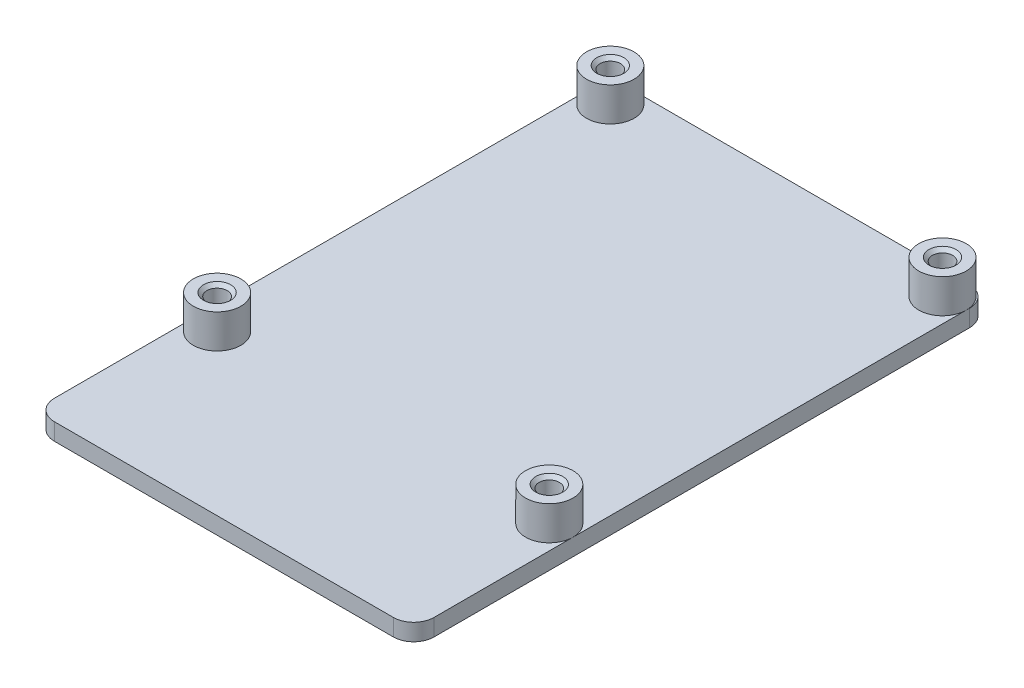
ISO-10303-21;
HEADER;
FILE_DESCRIPTION(('STEP AP214'),'2;1');
FILE_NAME('part.step','',(''),(''),'','','');
FILE_SCHEMA(('AUTOMOTIVE_DESIGN { 1 0 10303 214 1 1 1 1 }'));
ENDSEC;
DATA;
#1=APPLICATION_CONTEXT('core data for automotive mechanical design processes');
#2=APPLICATION_PROTOCOL_DEFINITION('international standard','automotive_design',2000,#1);
#3=PRODUCT_CONTEXT('',#1,'mechanical');
#4=PRODUCT('Part','Part','',(#3));
#5=PRODUCT_RELATED_PRODUCT_CATEGORY('part','',(#4));
#6=PRODUCT_DEFINITION_FORMATION('','',#4);
#7=PRODUCT_DEFINITION_CONTEXT('part definition',#1,'design');
#8=PRODUCT_DEFINITION('design','',#6,#7);
#9=PRODUCT_DEFINITION_SHAPE('','',#8);
#10=(LENGTH_UNIT() NAMED_UNIT(*) SI_UNIT(.MILLI.,.METRE.));
#11=(NAMED_UNIT(*) PLANE_ANGLE_UNIT() SI_UNIT($,.RADIAN.));
#12=(NAMED_UNIT(*) SI_UNIT($,.STERADIAN.) SOLID_ANGLE_UNIT());
#13=UNCERTAINTY_MEASURE_WITH_UNIT(LENGTH_MEASURE(1.E-05),#10,'distance_accuracy_value','');
#14=(GEOMETRIC_REPRESENTATION_CONTEXT(3) GLOBAL_UNCERTAINTY_ASSIGNED_CONTEXT((#13)) GLOBAL_UNIT_ASSIGNED_CONTEXT((#10,
#11,#12)) REPRESENTATION_CONTEXT('',''));
#15=CARTESIAN_POINT('',(0.,0.,0.));
#16=DIRECTION('',(0.,0.,1.));
#17=DIRECTION('',(1.,0.,0.));
#18=AXIS2_PLACEMENT_3D('',#15,#16,#17);
#19=CARTESIAN_POINT('',(-65.,2.5,-85.95));
#20=DIRECTION('',(0.,1.,0.));
#21=DIRECTION('',(0.,0.,1.));
#22=AXIS2_PLACEMENT_3D('',#19,#20,#21);
#23=PLANE('',#22);
#24=DIRECTION('',(-1.,0.,0.));
#25=VECTOR('',#24,1.);
#26=CARTESIAN_POINT('',(-65.,2.5,-88.95));
#27=LINE('',#26,#25);
#28=CARTESIAN_POINT('',(-15.,2.5,-88.95));
#29=VERTEX_POINT('',#28);
#30=CARTESIAN_POINT('',(-15.5,2.5,-88.95));
#31=VERTEX_POINT('',#30);
#32=EDGE_CURVE('E147',#29,#31,#27,.T.);
#33=ORIENTED_EDGE('',*,*,#32,.T.);
#34=CARTESIAN_POINT('',(-15.5,2.5,-85.45));
#35=DIRECTION('',(0.,1.,0.));
#36=DIRECTION('',(0.,0.,1.));
#37=AXIS2_PLACEMENT_3D('',#34,#35,#36);
#38=CIRCLE('',#37,3.5);
#39=CARTESIAN_POINT('',(-12.,2.5,-85.45));
#40=VERTEX_POINT('',#39);
#41=EDGE_CURVE('E138',#40,#31,#38,.T.);
#42=ORIENTED_EDGE('',*,*,#41,.F.);
#43=DIRECTION('',(0.,0.,-1.));
#44=VECTOR('',#43,1.);
#45=CARTESIAN_POINT('',(-12.,2.5,-85.95));
#46=LINE('',#45,#44);
#47=CARTESIAN_POINT('',(-12.,2.5,-85.95));
#48=VERTEX_POINT('',#47);
#49=EDGE_CURVE('E133',#40,#48,#46,.T.);
#50=ORIENTED_EDGE('',*,*,#49,.T.);
#51=CARTESIAN_POINT('',(-15.,2.5,-85.95));
#52=DIRECTION('',(0.,1.,0.));
#53=DIRECTION('',(0.,0.,1.));
#54=AXIS2_PLACEMENT_3D('',#51,#52,#53);
#55=CIRCLE('',#54,3.00000000000001);
#56=EDGE_CURVE('E163',#48,#29,#55,.T.);
#57=ORIENTED_EDGE('',*,*,#56,.T.);
#58=EDGE_LOOP('',(#33,#42,#50,#57));
#59=FACE_BOUND('',#58,.T.);
#60=ADVANCED_FACE('F39',(#59),#23,.T.);
#61=CARTESIAN_POINT('',(-64.5,2.5,-85.45));
#62=DIRECTION('',(0.,1.,0.));
#63=DIRECTION('',(0.,0.,1.));
#64=AXIS2_PLACEMENT_3D('',#61,#62,#63);
#65=CIRCLE('',#64,3.5);
#66=CARTESIAN_POINT('',(-64.5,2.5,-88.95));
#67=VERTEX_POINT('',#66);
#68=CARTESIAN_POINT('',(-68.,2.5,-85.45));
#69=VERTEX_POINT('',#68);
#70=EDGE_CURVE('E352',#67,#69,#65,.T.);
#71=ORIENTED_EDGE('',*,*,#70,.F.);
#72=CARTESIAN_POINT('',(-65.,2.5,-88.95));
#73=VERTEX_POINT('',#72);
#74=EDGE_CURVE('E165',#67,#73,#27,.T.);
#75=ORIENTED_EDGE('',*,*,#74,.T.);
#76=CARTESIAN_POINT('',(-65.,2.5,-85.95));
#77=DIRECTION('',(0.,1.,0.));
#78=DIRECTION('',(0.,0.,1.));
#79=AXIS2_PLACEMENT_3D('',#76,#77,#78);
#80=CIRCLE('',#79,2.99999999999999);
#81=CARTESIAN_POINT('',(-68.,2.5,-85.95));
#82=VERTEX_POINT('',#81);
#83=EDGE_CURVE('E199',#73,#82,#80,.T.);
#84=ORIENTED_EDGE('',*,*,#83,.T.);
#85=DIRECTION('',(0.,0.,1.));
#86=VECTOR('',#85,1.);
#87=CARTESIAN_POINT('',(-68.,2.5,-85.95));
#88=LINE('',#87,#86);
#89=EDGE_CURVE('E368',#82,#69,#88,.T.);
#90=ORIENTED_EDGE('',*,*,#89,.T.);
#91=EDGE_LOOP('',(#71,#75,#84,#90));
#92=FACE_BOUND('',#91,.T.);
#93=ADVANCED_FACE('F280',(#92),#23,.T.);
#94=CARTESIAN_POINT('',(-65.,2.5,-85.95));
#95=DIRECTION('',(0.,-1.,0.));
#96=DIRECTION('',(0.,0.,-1.));
#97=AXIS2_PLACEMENT_3D('',#94,#95,#96);
#98=CYLINDRICAL_SURFACE('',#97,2.99999999999999);
#99=CARTESIAN_POINT('',(-65.,0.,-85.95));
#100=DIRECTION('',(0.,1.,0.));
#101=DIRECTION('',(0.,0.,1.));
#102=AXIS2_PLACEMENT_3D('',#99,#100,#101);
#103=CIRCLE('',#102,2.99999999999999);
#104=CARTESIAN_POINT('',(-65.,0.,-88.95));
#105=VERTEX_POINT('',#104);
#106=CARTESIAN_POINT('',(-68.,0.,-85.95));
#107=VERTEX_POINT('',#106);
#108=EDGE_CURVE('E173',#105,#107,#103,.T.);
#109=ORIENTED_EDGE('',*,*,#108,.T.);
#110=DIRECTION('',(0.,-1.,0.));
#111=VECTOR('',#110,1.);
#112=CARTESIAN_POINT('',(-68.,2.5,-85.95));
#113=LINE('',#112,#111);
#114=EDGE_CURVE('E225',#82,#107,#113,.T.);
#115=ORIENTED_EDGE('',*,*,#114,.F.);
#116=ORIENTED_EDGE('',*,*,#83,.F.);
#117=DIRECTION('',(0.,-1.,0.));
#118=VECTOR('',#117,1.);
#119=CARTESIAN_POINT('',(-65.,2.5,-88.95));
#120=LINE('',#119,#118);
#121=EDGE_CURVE('E172',#73,#105,#120,.T.);
#122=ORIENTED_EDGE('',*,*,#121,.T.);
#123=EDGE_LOOP('',(#109,#115,#116,#122));
#124=FACE_BOUND('',#123,.T.);
#125=ADVANCED_FACE('F287',(#124),#98,.T.);
#126=CARTESIAN_POINT('',(-68.,2.5,-85.95));
#127=DIRECTION('',(1.,0.,0.));
#128=DIRECTION('',(0.,0.,-1.));
#129=AXIS2_PLACEMENT_3D('',#126,#127,#128);
#130=PLANE('',#129);
#131=DIRECTION('',(0.,0.,1.));
#132=VECTOR('',#131,1.);
#133=CARTESIAN_POINT('',(-68.,0.,-85.95));
#134=LINE('',#133,#132);
#135=CARTESIAN_POINT('',(-68.,0.,-6.94999999999999));
#136=VERTEX_POINT('',#135);
#137=EDGE_CURVE('E177',#107,#136,#134,.T.);
#138=ORIENTED_EDGE('',*,*,#137,.T.);
#139=DIRECTION('',(0.,-1.,0.));
#140=VECTOR('',#139,1.);
#141=CARTESIAN_POINT('',(-68.,2.5,-6.94999999999999));
#142=LINE('',#141,#140);
#143=CARTESIAN_POINT('',(-68.,2.5,-6.94999999999999));
#144=VERTEX_POINT('',#143);
#145=EDGE_CURVE('E221',#144,#136,#142,.T.);
#146=ORIENTED_EDGE('',*,*,#145,.F.);
#147=CARTESIAN_POINT('',(-68.,2.5,-27.45));
#148=VERTEX_POINT('',#147);
#149=EDGE_CURVE('E367',#148,#144,#88,.T.);
#150=ORIENTED_EDGE('',*,*,#149,.F.);
#151=EDGE_CURVE('E373',#69,#148,#88,.T.);
#152=ORIENTED_EDGE('',*,*,#151,.F.);
#153=ORIENTED_EDGE('',*,*,#89,.F.);
#154=ORIENTED_EDGE('',*,*,#114,.T.);
#155=EDGE_LOOP('',(#138,#146,#150,#152,#153,#154));
#156=FACE_BOUND('',#155,.T.);
#157=ADVANCED_FACE('F404',(#156),#130,.F.);
#158=CARTESIAN_POINT('',(-65.,2.5,-6.95000000000001));
#159=DIRECTION('',(0.,-1.,0.));
#160=DIRECTION('',(0.,0.,-1.));
#161=AXIS2_PLACEMENT_3D('',#158,#159,#160);
#162=CYLINDRICAL_SURFACE('',#161,2.99999999999999);
#163=CARTESIAN_POINT('',(-65.,0.,-6.95000000000001));
#164=DIRECTION('',(0.,1.,0.));
#165=DIRECTION('',(0.,0.,1.));
#166=AXIS2_PLACEMENT_3D('',#163,#164,#165);
#167=CIRCLE('',#166,2.99999999999999);
#168=CARTESIAN_POINT('',(-65.,0.,-3.95000000000002));
#169=VERTEX_POINT('',#168);
#170=EDGE_CURVE('E181',#136,#169,#167,.T.);
#171=ORIENTED_EDGE('',*,*,#170,.T.);
#172=DIRECTION('',(0.,-1.,0.));
#173=VECTOR('',#172,1.);
#174=CARTESIAN_POINT('',(-65.,2.5,-3.95000000000002));
#175=LINE('',#174,#173);
#176=CARTESIAN_POINT('',(-65.,2.5,-3.95000000000002));
#177=VERTEX_POINT('',#176);
#178=EDGE_CURVE('E217',#177,#169,#175,.T.);
#179=ORIENTED_EDGE('',*,*,#178,.F.);
#180=CARTESIAN_POINT('',(-65.,2.5,-6.95000000000001));
#181=DIRECTION('',(0.,1.,0.));
#182=DIRECTION('',(0.,0.,1.));
#183=AXIS2_PLACEMENT_3D('',#180,#181,#182);
#184=CIRCLE('',#183,2.99999999999999);
#185=EDGE_CURVE('E372',#144,#177,#184,.T.);
#186=ORIENTED_EDGE('',*,*,#185,.F.);
#187=ORIENTED_EDGE('',*,*,#145,.T.);
#188=EDGE_LOOP('',(#171,#179,#186,#187));
#189=FACE_BOUND('',#188,.T.);
#190=ADVANCED_FACE('F412',(#189),#162,.T.);
#191=CARTESIAN_POINT('',(-65.,2.5,-3.95000000000002));
#192=DIRECTION('',(0.,0.,-1.));
#193=DIRECTION('',(-1.,0.,0.));
#194=AXIS2_PLACEMENT_3D('',#191,#192,#193);
#195=PLANE('',#194);
#196=DIRECTION('',(1.,0.,0.));
#197=VECTOR('',#196,1.);
#198=CARTESIAN_POINT('',(-65.,0.,-3.95000000000002));
#199=LINE('',#198,#197);
#200=CARTESIAN_POINT('',(-15.,0.,-3.94999999999999));
#201=VERTEX_POINT('',#200);
#202=EDGE_CURVE('E184',#169,#201,#199,.T.);
#203=ORIENTED_EDGE('',*,*,#202,.T.);
#204=DIRECTION('',(0.,-1.,0.));
#205=VECTOR('',#204,1.);
#206=CARTESIAN_POINT('',(-15.,2.5,-3.94999999999999));
#207=LINE('',#206,#205);
#208=CARTESIAN_POINT('',(-15.,2.5,-3.94999999999999));
#209=VERTEX_POINT('',#208);
#210=EDGE_CURVE('E213',#209,#201,#207,.T.);
#211=ORIENTED_EDGE('',*,*,#210,.F.);
#212=DIRECTION('',(1.,0.,0.));
#213=VECTOR('',#212,1.);
#214=CARTESIAN_POINT('',(-65.,2.5,-3.95000000000002));
#215=LINE('',#214,#213);
#216=EDGE_CURVE('E159',#177,#209,#215,.T.);
#217=ORIENTED_EDGE('',*,*,#216,.F.);
#218=ORIENTED_EDGE('',*,*,#178,.T.);
#219=EDGE_LOOP('',(#203,#211,#217,#218));
#220=FACE_BOUND('',#219,.T.);
#221=ADVANCED_FACE('F384',(#220),#195,.F.);
#222=CARTESIAN_POINT('',(-15.,2.5,-6.95));
#223=DIRECTION('',(0.,-1.,0.));
#224=DIRECTION('',(0.,0.,-1.));
#225=AXIS2_PLACEMENT_3D('',#222,#223,#224);
#226=CYLINDRICAL_SURFACE('',#225,3.00000000000001);
#227=CARTESIAN_POINT('',(-15.,0.,-6.95));
#228=DIRECTION('',(0.,1.,0.));
#229=DIRECTION('',(0.,0.,1.));
#230=AXIS2_PLACEMENT_3D('',#227,#228,#229);
#231=CIRCLE('',#230,3.00000000000001);
#232=CARTESIAN_POINT('',(-12.,0.,-6.95));
#233=VERTEX_POINT('',#232);
#234=EDGE_CURVE('E187',#201,#233,#231,.T.);
#235=ORIENTED_EDGE('',*,*,#234,.T.);
#236=DIRECTION('',(0.,-1.,0.));
#237=VECTOR('',#236,1.);
#238=CARTESIAN_POINT('',(-12.,2.5,-6.95));
#239=LINE('',#238,#237);
#240=CARTESIAN_POINT('',(-12.,2.5,-6.95));
#241=VERTEX_POINT('',#240);
#242=EDGE_CURVE('E209',#241,#233,#239,.T.);
#243=ORIENTED_EDGE('',*,*,#242,.F.);
#244=CARTESIAN_POINT('',(-15.,2.5,-6.95));
#245=DIRECTION('',(0.,1.,0.));
#246=DIRECTION('',(0.,0.,1.));
#247=AXIS2_PLACEMENT_3D('',#244,#245,#246);
#248=CIRCLE('',#247,3.00000000000001);
#249=EDGE_CURVE('E157',#209,#241,#248,.T.);
#250=ORIENTED_EDGE('',*,*,#249,.F.);
#251=ORIENTED_EDGE('',*,*,#210,.T.);
#252=EDGE_LOOP('',(#235,#243,#250,#251));
#253=FACE_BOUND('',#252,.T.);
#254=ADVANCED_FACE('F388',(#253),#226,.T.);
#255=CARTESIAN_POINT('',(-12.,2.5,-85.95));
#256=DIRECTION('',(-1.,0.,0.));
#257=DIRECTION('',(0.,0.,1.));
#258=AXIS2_PLACEMENT_3D('',#255,#256,#257);
#259=PLANE('',#258);
#260=DIRECTION('',(0.,0.,-1.));
#261=VECTOR('',#260,1.);
#262=CARTESIAN_POINT('',(-12.,0.,-85.95));
#263=LINE('',#262,#261);
#264=CARTESIAN_POINT('',(-12.,0.,-85.95));
#265=VERTEX_POINT('',#264);
#266=EDGE_CURVE('E190',#233,#265,#263,.T.);
#267=ORIENTED_EDGE('',*,*,#266,.T.);
#268=DIRECTION('',(0.,-1.,0.));
#269=VECTOR('',#268,1.);
#270=CARTESIAN_POINT('',(-12.,2.5,-85.95));
#271=LINE('',#270,#269);
#272=EDGE_CURVE('E154',#48,#265,#271,.T.);
#273=ORIENTED_EDGE('',*,*,#272,.F.);
#274=ORIENTED_EDGE('',*,*,#49,.F.);
#275=CARTESIAN_POINT('',(-12.,2.5,-27.45));
#276=VERTEX_POINT('',#275);
#277=EDGE_CURVE('E121',#276,#40,#46,.T.);
#278=ORIENTED_EDGE('',*,*,#277,.F.);
#279=EDGE_CURVE('E132',#241,#276,#46,.T.);
#280=ORIENTED_EDGE('',*,*,#279,.F.);
#281=ORIENTED_EDGE('',*,*,#242,.T.);
#282=EDGE_LOOP('',(#267,#273,#274,#278,#280,#281));
#283=FACE_BOUND('',#282,.T.);
#284=ADVANCED_FACE('F152',(#283),#259,.F.);
#285=CARTESIAN_POINT('',(-15.,2.5,-85.95));
#286=DIRECTION('',(0.,-1.,0.));
#287=DIRECTION('',(0.,0.,-1.));
#288=AXIS2_PLACEMENT_3D('',#285,#286,#287);
#289=CYLINDRICAL_SURFACE('',#288,3.00000000000001);
#290=CARTESIAN_POINT('',(-15.,0.,-85.95));
#291=DIRECTION('',(0.,1.,0.));
#292=DIRECTION('',(0.,0.,1.));
#293=AXIS2_PLACEMENT_3D('',#290,#291,#292);
#294=CIRCLE('',#293,3.00000000000001);
#295=CARTESIAN_POINT('',(-15.,0.,-88.95));
#296=VERTEX_POINT('',#295);
#297=EDGE_CURVE('E193',#265,#296,#294,.T.);
#298=ORIENTED_EDGE('',*,*,#297,.T.);
#299=DIRECTION('',(0.,-1.,0.));
#300=VECTOR('',#299,1.);
#301=CARTESIAN_POINT('',(-15.,2.5,-88.95));
#302=LINE('',#301,#300);
#303=EDGE_CURVE('E203',#29,#296,#302,.T.);
#304=ORIENTED_EDGE('',*,*,#303,.F.);
#305=ORIENTED_EDGE('',*,*,#56,.F.);
#306=ORIENTED_EDGE('',*,*,#272,.T.);
#307=EDGE_LOOP('',(#298,#304,#305,#306));
#308=FACE_BOUND('',#307,.T.);
#309=ADVANCED_FACE('F334',(#308),#289,.T.);
#310=CARTESIAN_POINT('',(-65.,2.5,-88.95));
#311=DIRECTION('',(0.,0.,1.));
#312=DIRECTION('',(1.,0.,0.));
#313=AXIS2_PLACEMENT_3D('',#310,#311,#312);
#314=PLANE('',#313);
#315=DIRECTION('',(-1.,0.,0.));
#316=VECTOR('',#315,1.);
#317=CARTESIAN_POINT('',(-65.,0.,-88.95));
#318=LINE('',#317,#316);
#319=EDGE_CURVE('E196',#296,#105,#318,.T.);
#320=ORIENTED_EDGE('',*,*,#319,.T.);
#321=ORIENTED_EDGE('',*,*,#121,.F.);
#322=ORIENTED_EDGE('',*,*,#74,.F.);
#323=EDGE_CURVE('E168',#31,#67,#27,.T.);
#324=ORIENTED_EDGE('',*,*,#323,.F.);
#325=ORIENTED_EDGE('',*,*,#32,.F.);
#326=ORIENTED_EDGE('',*,*,#303,.T.);
#327=EDGE_LOOP('',(#320,#321,#322,#324,#325,#326));
#328=FACE_BOUND('',#327,.T.);
#329=ADVANCED_FACE('F327',(#328),#314,.F.);
#330=ORIENTED_EDGE('',*,*,#151,.T.);
#331=CARTESIAN_POINT('',(-64.5,2.5,-27.45));
#332=DIRECTION('',(0.,1.,0.));
#333=DIRECTION('',(0.,0.,1.));
#334=AXIS2_PLACEMENT_3D('',#331,#332,#333);
#335=CIRCLE('',#334,3.5);
#336=EDGE_CURVE('E53',#148,#148,#335,.T.);
#337=ORIENTED_EDGE('',*,*,#336,.F.);
#338=ORIENTED_EDGE('',*,*,#149,.T.);
#339=ORIENTED_EDGE('',*,*,#185,.T.);
#340=ORIENTED_EDGE('',*,*,#216,.T.);
#341=ORIENTED_EDGE('',*,*,#249,.T.);
#342=ORIENTED_EDGE('',*,*,#279,.T.);
#343=CARTESIAN_POINT('',(-15.5,2.5,-27.45));
#344=DIRECTION('',(0.,1.,0.));
#345=DIRECTION('',(0.,0.,1.));
#346=AXIS2_PLACEMENT_3D('',#343,#344,#345);
#347=CIRCLE('',#346,3.5);
#348=EDGE_CURVE('E58',#276,#276,#347,.T.);
#349=ORIENTED_EDGE('',*,*,#348,.F.);
#350=ORIENTED_EDGE('',*,*,#277,.T.);
#351=CARTESIAN_POINT('',(-15.5,2.5,-85.45));
#352=DIRECTION('',(0.,1.,0.));
#353=DIRECTION('',(0.,0.,1.));
#354=AXIS2_PLACEMENT_3D('',#351,#352,#353);
#355=CIRCLE('',#354,3.5);
#356=EDGE_CURVE('E125',#40,#31,#355,.F.);
#357=ORIENTED_EDGE('',*,*,#356,.T.);
#358=ORIENTED_EDGE('',*,*,#323,.T.);
#359=EDGE_CURVE('E229',#69,#67,#65,.T.);
#360=ORIENTED_EDGE('',*,*,#359,.F.);
#361=EDGE_LOOP('',(#330,#337,#338,#339,#340,#341,#342,#349,#350,#357,#358,#360));
#362=FACE_BOUND('',#361,.T.);
#363=ADVANCED_FACE('F124',(#362),#23,.T.);
#364=CARTESIAN_POINT('',(-65.,0.,-85.95));
#365=DIRECTION('',(0.,1.,0.));
#366=DIRECTION('',(0.,0.,1.));
#367=AXIS2_PLACEMENT_3D('',#364,#365,#366);
#368=PLANE('',#367);
#369=ORIENTED_EDGE('',*,*,#108,.F.);
#370=ORIENTED_EDGE('',*,*,#319,.F.);
#371=ORIENTED_EDGE('',*,*,#297,.F.);
#372=ORIENTED_EDGE('',*,*,#266,.F.);
#373=ORIENTED_EDGE('',*,*,#234,.F.);
#374=ORIENTED_EDGE('',*,*,#202,.F.);
#375=ORIENTED_EDGE('',*,*,#170,.F.);
#376=ORIENTED_EDGE('',*,*,#137,.F.);
#377=EDGE_LOOP('',(#369,#370,#371,#372,#373,#374,#375,#376));
#378=FACE_BOUND('',#377,.T.);
#379=ADVANCED_FACE('F326',(#378),#368,.F.);
#380=CARTESIAN_POINT('',(-64.5,7.5,-85.45));
#381=DIRECTION('',(0.,1.,0.));
#382=DIRECTION('',(0.,0.,1.));
#383=AXIS2_PLACEMENT_3D('',#380,#381,#382);
#384=PLANE('',#383);
#385=CARTESIAN_POINT('',(-64.5,7.5,-85.45));
#386=DIRECTION('',(0.,1.,0.));
#387=DIRECTION('',(0.,0.,1.));
#388=AXIS2_PLACEMENT_3D('',#385,#386,#387);
#389=CIRCLE('',#388,2.00000000000003);
#390=CARTESIAN_POINT('',(-64.5,7.5,-83.45));
#391=VERTEX_POINT('',#390);
#392=EDGE_CURVE('E11',#391,#391,#389,.F.);
#393=ORIENTED_EDGE('',*,*,#392,.T.);
#394=EDGE_LOOP('',(#393));
#395=FACE_BOUND('',#394,.T.);
#396=CARTESIAN_POINT('',(-64.5,7.5,-85.45));
#397=DIRECTION('',(0.,1.,0.));
#398=DIRECTION('',(0.,0.,1.));
#399=AXIS2_PLACEMENT_3D('',#396,#397,#398);
#400=CIRCLE('',#399,3.5);
#401=CARTESIAN_POINT('',(-64.5,7.5,-81.95));
#402=VERTEX_POINT('',#401);
#403=EDGE_CURVE('E178',#402,#402,#400,.T.);
#404=ORIENTED_EDGE('',*,*,#403,.T.);
#405=EDGE_LOOP('',(#404));
#406=FACE_BOUND('',#405,.T.);
#407=ADVANCED_FACE('F332',(#395,#406),#384,.T.);
#408=CARTESIAN_POINT('',(-64.5,7.5,-85.45));
#409=DIRECTION('',(0.,-1.,0.));
#410=DIRECTION('',(0.,0.,-1.));
#411=AXIS2_PLACEMENT_3D('',#408,#409,#410);
#412=CYLINDRICAL_SURFACE('',#411,3.5);
#413=ORIENTED_EDGE('',*,*,#403,.F.);
#414=EDGE_LOOP('',(#413));
#415=FACE_BOUND('',#414,.T.);
#416=ORIENTED_EDGE('',*,*,#70,.T.);
#417=ORIENTED_EDGE('',*,*,#359,.T.);
#418=EDGE_LOOP('',(#416,#417));
#419=FACE_BOUND('',#418,.T.);
#420=ADVANCED_FACE('F346',(#415,#419),#412,.T.);
#421=CARTESIAN_POINT('',(-64.5,7.5,-85.45));
#422=DIRECTION('',(0.,-1.,0.));
#423=DIRECTION('',(0.,0.,-1.));
#424=AXIS2_PLACEMENT_3D('',#421,#422,#423);
#425=CYLINDRICAL_SURFACE('',#424,1.5);
#426=CARTESIAN_POINT('',(-64.5,6.99999999999996,-85.45));
#427=DIRECTION('',(0.,1.,0.));
#428=DIRECTION('',(0.,0.,1.));
#429=AXIS2_PLACEMENT_3D('',#426,#427,#428);
#430=CIRCLE('',#429,1.5);
#431=CARTESIAN_POINT('',(-64.5,6.99999999999996,-83.95));
#432=VERTEX_POINT('',#431);
#433=EDGE_CURVE('E48',#432,#432,#430,.T.);
#434=ORIENTED_EDGE('',*,*,#433,.T.);
#435=EDGE_LOOP('',(#434));
#436=FACE_BOUND('',#435,.T.);
#437=CARTESIAN_POINT('',(-64.5,2.5,-85.45));
#438=DIRECTION('',(0.,1.,0.));
#439=DIRECTION('',(0.,0.,1.));
#440=AXIS2_PLACEMENT_3D('',#437,#438,#439);
#441=CIRCLE('',#440,1.5);
#442=CARTESIAN_POINT('',(-64.5,2.5,-83.95));
#443=VERTEX_POINT('',#442);
#444=EDGE_CURVE('E350',#443,#443,#441,.T.);
#445=ORIENTED_EDGE('',*,*,#444,.F.);
#446=EDGE_LOOP('',(#445));
#447=FACE_BOUND('',#446,.T.);
#448=ADVANCED_FACE('F267',(#436,#447),#425,.F.);
#449=ORIENTED_EDGE('',*,*,#444,.T.);
#450=EDGE_LOOP('',(#449));
#451=FACE_BOUND('',#450,.T.);
#452=ADVANCED_FACE('F289',(#451),#23,.T.);
#453=CARTESIAN_POINT('',(-15.5,7.5,-85.45));
#454=DIRECTION('',(0.,1.,0.));
#455=DIRECTION('',(0.,0.,1.));
#456=AXIS2_PLACEMENT_3D('',#453,#454,#455);
#457=PLANE('',#456);
#458=CARTESIAN_POINT('',(-15.5,7.5,-85.45));
#459=DIRECTION('',(0.,1.,0.));
#460=DIRECTION('',(0.,0.,1.));
#461=AXIS2_PLACEMENT_3D('',#458,#459,#460);
#462=CIRCLE('',#461,2.00000000000003);
#463=CARTESIAN_POINT('',(-15.5,7.5,-83.45));
#464=VERTEX_POINT('',#463);
#465=EDGE_CURVE('E260',#464,#464,#462,.F.);
#466=ORIENTED_EDGE('',*,*,#465,.T.);
#467=EDGE_LOOP('',(#466));
#468=FACE_BOUND('',#467,.T.);
#469=CARTESIAN_POINT('',(-15.5,7.5,-85.45));
#470=DIRECTION('',(0.,1.,0.));
#471=DIRECTION('',(0.,0.,1.));
#472=AXIS2_PLACEMENT_3D('',#469,#470,#471);
#473=CIRCLE('',#472,3.5);
#474=CARTESIAN_POINT('',(-15.5,7.5,-81.95));
#475=VERTEX_POINT('',#474);
#476=EDGE_CURVE('E149',#475,#475,#473,.T.);
#477=ORIENTED_EDGE('',*,*,#476,.T.);
#478=EDGE_LOOP('',(#477));
#479=FACE_BOUND('',#478,.T.);
#480=ADVANCED_FACE('F338',(#468,#479),#457,.T.);
#481=CARTESIAN_POINT('',(-15.5,7.5,-85.45));
#482=DIRECTION('',(0.,-1.,0.));
#483=DIRECTION('',(0.,0.,-1.));
#484=AXIS2_PLACEMENT_3D('',#481,#482,#483);
#485=CYLINDRICAL_SURFACE('',#484,3.5);
#486=ORIENTED_EDGE('',*,*,#476,.F.);
#487=EDGE_LOOP('',(#486));
#488=FACE_BOUND('',#487,.T.);
#489=ORIENTED_EDGE('',*,*,#41,.T.);
#490=ORIENTED_EDGE('',*,*,#356,.F.);
#491=EDGE_LOOP('',(#489,#490));
#492=FACE_BOUND('',#491,.T.);
#493=ADVANCED_FACE('F137',(#488,#492),#485,.T.);
#494=CARTESIAN_POINT('',(-15.5,7.5,-85.45));
#495=DIRECTION('',(0.,-1.,0.));
#496=DIRECTION('',(0.,0.,-1.));
#497=AXIS2_PLACEMENT_3D('',#494,#495,#496);
#498=CYLINDRICAL_SURFACE('',#497,1.5);
#499=CARTESIAN_POINT('',(-15.5,6.99999999999998,-85.45));
#500=DIRECTION('',(0.,1.,0.));
#501=DIRECTION('',(0.,0.,1.));
#502=AXIS2_PLACEMENT_3D('',#499,#500,#501);
#503=CIRCLE('',#502,1.5);
#504=CARTESIAN_POINT('',(-15.5,6.99999999999998,-83.95));
#505=VERTEX_POINT('',#504);
#506=EDGE_CURVE('E256',#505,#505,#503,.T.);
#507=ORIENTED_EDGE('',*,*,#506,.T.);
#508=EDGE_LOOP('',(#507));
#509=FACE_BOUND('',#508,.T.);
#510=CARTESIAN_POINT('',(-15.5,2.5,-85.45));
#511=DIRECTION('',(0.,1.,0.));
#512=DIRECTION('',(0.,0.,1.));
#513=AXIS2_PLACEMENT_3D('',#510,#511,#512);
#514=CIRCLE('',#513,1.5);
#515=CARTESIAN_POINT('',(-15.5,2.5,-83.95));
#516=VERTEX_POINT('',#515);
#517=EDGE_CURVE('E141',#516,#516,#514,.F.);
#518=ORIENTED_EDGE('',*,*,#517,.T.);
#519=EDGE_LOOP('',(#518));
#520=FACE_BOUND('',#519,.T.);
#521=ADVANCED_FACE('F294',(#509,#520),#498,.F.);
#522=ORIENTED_EDGE('',*,*,#517,.F.);
#523=EDGE_LOOP('',(#522));
#524=FACE_BOUND('',#523,.T.);
#525=ADVANCED_FACE('F282',(#524),#23,.T.);
#526=CARTESIAN_POINT('',(-15.5,7.5,-27.45));
#527=DIRECTION('',(0.,1.,0.));
#528=DIRECTION('',(0.,0.,1.));
#529=AXIS2_PLACEMENT_3D('',#526,#527,#528);
#530=PLANE('',#529);
#531=CARTESIAN_POINT('',(-15.5,7.5,-27.45));
#532=DIRECTION('',(0.,1.,0.));
#533=DIRECTION('',(0.,0.,1.));
#534=AXIS2_PLACEMENT_3D('',#531,#532,#533);
#535=CIRCLE('',#534,2.00000000000003);
#536=CARTESIAN_POINT('',(-15.5,7.5,-25.45));
#537=VERTEX_POINT('',#536);
#538=EDGE_CURVE('E252',#537,#537,#535,.F.);
#539=ORIENTED_EDGE('',*,*,#538,.T.);
#540=EDGE_LOOP('',(#539));
#541=FACE_BOUND('',#540,.T.);
#542=CARTESIAN_POINT('',(-15.5,7.5,-27.45));
#543=DIRECTION('',(0.,1.,0.));
#544=DIRECTION('',(0.,0.,1.));
#545=AXIS2_PLACEMENT_3D('',#542,#543,#544);
#546=CIRCLE('',#545,3.5);
#547=CARTESIAN_POINT('',(-15.5,7.5,-23.95));
#548=VERTEX_POINT('',#547);
#549=EDGE_CURVE('E150',#548,#548,#546,.T.);
#550=ORIENTED_EDGE('',*,*,#549,.T.);
#551=EDGE_LOOP('',(#550));
#552=FACE_BOUND('',#551,.T.);
#553=ADVANCED_FACE('F293',(#541,#552),#530,.T.);
#554=CARTESIAN_POINT('',(-15.5,7.5,-27.45));
#555=DIRECTION('',(0.,-1.,0.));
#556=DIRECTION('',(0.,0.,-1.));
#557=AXIS2_PLACEMENT_3D('',#554,#555,#556);
#558=CYLINDRICAL_SURFACE('',#557,3.5);
#559=ORIENTED_EDGE('',*,*,#549,.F.);
#560=EDGE_LOOP('',(#559));
#561=FACE_BOUND('',#560,.T.);
#562=ORIENTED_EDGE('',*,*,#348,.T.);
#563=EDGE_LOOP('',(#562));
#564=FACE_BOUND('',#563,.T.);
#565=ADVANCED_FACE('F308',(#561,#564),#558,.T.);
#566=CARTESIAN_POINT('',(-15.5,7.5,-27.45));
#567=DIRECTION('',(0.,-1.,0.));
#568=DIRECTION('',(0.,0.,-1.));
#569=AXIS2_PLACEMENT_3D('',#566,#567,#568);
#570=CYLINDRICAL_SURFACE('',#569,1.5);
#571=CARTESIAN_POINT('',(-15.5,6.99999999999998,-27.45));
#572=DIRECTION('',(0.,1.,0.));
#573=DIRECTION('',(0.,0.,1.));
#574=AXIS2_PLACEMENT_3D('',#571,#572,#573);
#575=CIRCLE('',#574,1.5);
#576=CARTESIAN_POINT('',(-15.5,6.99999999999998,-25.95));
#577=VERTEX_POINT('',#576);
#578=EDGE_CURVE('E248',#577,#577,#575,.T.);
#579=ORIENTED_EDGE('',*,*,#578,.T.);
#580=EDGE_LOOP('',(#579));
#581=FACE_BOUND('',#580,.T.);
#582=CARTESIAN_POINT('',(-15.5,2.5,-27.45));
#583=DIRECTION('',(0.,1.,0.));
#584=DIRECTION('',(0.,0.,1.));
#585=AXIS2_PLACEMENT_3D('',#582,#583,#584);
#586=CIRCLE('',#585,1.5);
#587=CARTESIAN_POINT('',(-15.5,2.5,-25.95));
#588=VERTEX_POINT('',#587);
#589=EDGE_CURVE('E140',#588,#588,#586,.F.);
#590=ORIENTED_EDGE('',*,*,#589,.T.);
#591=EDGE_LOOP('',(#590));
#592=FACE_BOUND('',#591,.T.);
#593=ADVANCED_FACE('F298',(#581,#592),#570,.F.);
#594=ORIENTED_EDGE('',*,*,#589,.F.);
#595=EDGE_LOOP('',(#594));
#596=FACE_BOUND('',#595,.T.);
#597=ADVANCED_FACE('F283',(#596),#23,.T.);
#598=CARTESIAN_POINT('',(-64.5,7.5,-27.45));
#599=DIRECTION('',(0.,1.,0.));
#600=DIRECTION('',(0.,0.,1.));
#601=AXIS2_PLACEMENT_3D('',#598,#599,#600);
#602=PLANE('',#601);
#603=CARTESIAN_POINT('',(-64.5,7.5,-27.45));
#604=DIRECTION('',(0.,1.,0.));
#605=DIRECTION('',(0.,0.,1.));
#606=AXIS2_PLACEMENT_3D('',#603,#604,#605);
#607=CIRCLE('',#606,1.99999999999999);
#608=CARTESIAN_POINT('',(-64.5,7.5,-25.45));
#609=VERTEX_POINT('',#608);
#610=EDGE_CURVE('E244',#609,#609,#607,.F.);
#611=ORIENTED_EDGE('',*,*,#610,.T.);
#612=EDGE_LOOP('',(#611));
#613=FACE_BOUND('',#612,.T.);
#614=CARTESIAN_POINT('',(-64.5,7.5,-27.45));
#615=DIRECTION('',(0.,1.,0.));
#616=DIRECTION('',(0.,0.,1.));
#617=AXIS2_PLACEMENT_3D('',#614,#615,#616);
#618=CIRCLE('',#617,3.5);
#619=CARTESIAN_POINT('',(-64.5,7.5,-23.95));
#620=VERTEX_POINT('',#619);
#621=EDGE_CURVE('E443',#620,#620,#618,.T.);
#622=ORIENTED_EDGE('',*,*,#621,.T.);
#623=EDGE_LOOP('',(#622));
#624=FACE_BOUND('',#623,.T.);
#625=ADVANCED_FACE('F297',(#613,#624),#602,.T.);
#626=CARTESIAN_POINT('',(-64.5,7.5,-27.45));
#627=DIRECTION('',(0.,-1.,0.));
#628=DIRECTION('',(0.,0.,-1.));
#629=AXIS2_PLACEMENT_3D('',#626,#627,#628);
#630=CYLINDRICAL_SURFACE('',#629,3.5);
#631=ORIENTED_EDGE('',*,*,#621,.F.);
#632=EDGE_LOOP('',(#631));
#633=FACE_BOUND('',#632,.T.);
#634=ORIENTED_EDGE('',*,*,#336,.T.);
#635=EDGE_LOOP('',(#634));
#636=FACE_BOUND('',#635,.T.);
#637=ADVANCED_FACE('F305',(#633,#636),#630,.T.);
#638=CARTESIAN_POINT('',(-64.5,7.5,-27.45));
#639=DIRECTION('',(0.,-1.,0.));
#640=DIRECTION('',(0.,0.,-1.));
#641=AXIS2_PLACEMENT_3D('',#638,#639,#640);
#642=CYLINDRICAL_SURFACE('',#641,1.5);
#643=CARTESIAN_POINT('',(-64.5,7.,-27.45));
#644=DIRECTION('',(0.,1.,0.));
#645=DIRECTION('',(0.,0.,1.));
#646=AXIS2_PLACEMENT_3D('',#643,#644,#645);
#647=CIRCLE('',#646,1.5);
#648=CARTESIAN_POINT('',(-64.5,7.,-25.95));
#649=VERTEX_POINT('',#648);
#650=EDGE_CURVE('E240',#649,#649,#647,.T.);
#651=ORIENTED_EDGE('',*,*,#650,.T.);
#652=EDGE_LOOP('',(#651));
#653=FACE_BOUND('',#652,.T.);
#654=CARTESIAN_POINT('',(-64.5,2.5,-27.45));
#655=DIRECTION('',(0.,1.,0.));
#656=DIRECTION('',(0.,0.,1.));
#657=AXIS2_PLACEMENT_3D('',#654,#655,#656);
#658=CIRCLE('',#657,1.5);
#659=CARTESIAN_POINT('',(-64.5,2.5,-25.95));
#660=VERTEX_POINT('',#659);
#661=EDGE_CURVE('E236',#660,#660,#658,.F.);
#662=ORIENTED_EDGE('',*,*,#661,.T.);
#663=EDGE_LOOP('',(#662));
#664=FACE_BOUND('',#663,.T.);
#665=ADVANCED_FACE('F314',(#653,#664),#642,.F.);
#666=ORIENTED_EDGE('',*,*,#661,.F.);
#667=EDGE_LOOP('',(#666));
#668=FACE_BOUND('',#667,.T.);
#669=ADVANCED_FACE('F300',(#668),#23,.T.);
#670=CARTESIAN_POINT('',(-64.5,7.,-27.45));
#671=DIRECTION('',(0.,1.,0.));
#672=DIRECTION('',(0.,0.,1.));
#673=AXIS2_PLACEMENT_3D('',#670,#671,#672);
#674=CONICAL_SURFACE('',#673,1.5,0.785398163397443);
#675=ORIENTED_EDGE('',*,*,#610,.F.);
#676=EDGE_LOOP('',(#675));
#677=FACE_BOUND('',#676,.T.);
#678=ORIENTED_EDGE('',*,*,#650,.F.);
#679=EDGE_LOOP('',(#678));
#680=FACE_BOUND('',#679,.T.);
#681=ADVANCED_FACE('F313',(#677,#680),#674,.F.);
#682=CARTESIAN_POINT('',(-15.5,6.99999999999998,-27.45));
#683=DIRECTION('',(0.,1.,0.));
#684=DIRECTION('',(0.,0.,1.));
#685=AXIS2_PLACEMENT_3D('',#682,#683,#684);
#686=CONICAL_SURFACE('',#685,1.5,0.785398163397457);
#687=ORIENTED_EDGE('',*,*,#538,.F.);
#688=EDGE_LOOP('',(#687));
#689=FACE_BOUND('',#688,.T.);
#690=ORIENTED_EDGE('',*,*,#578,.F.);
#691=EDGE_LOOP('',(#690));
#692=FACE_BOUND('',#691,.T.);
#693=ADVANCED_FACE('F276',(#689,#692),#686,.F.);
#694=CARTESIAN_POINT('',(-15.5,6.99999999999998,-85.45));
#695=DIRECTION('',(0.,1.,0.));
#696=DIRECTION('',(0.,0.,1.));
#697=AXIS2_PLACEMENT_3D('',#694,#695,#696);
#698=CONICAL_SURFACE('',#697,1.5,0.785398163397457);
#699=ORIENTED_EDGE('',*,*,#465,.F.);
#700=EDGE_LOOP('',(#699));
#701=FACE_BOUND('',#700,.T.);
#702=ORIENTED_EDGE('',*,*,#506,.F.);
#703=EDGE_LOOP('',(#702));
#704=FACE_BOUND('',#703,.T.);
#705=ADVANCED_FACE('F271',(#701,#704),#698,.F.);
#706=CARTESIAN_POINT('',(-64.5,6.99999999999996,-85.45));
#707=DIRECTION('',(0.,1.,0.));
#708=DIRECTION('',(0.,0.,1.));
#709=AXIS2_PLACEMENT_3D('',#706,#707,#708);
#710=CONICAL_SURFACE('',#709,1.5,0.785398163397443);
#711=ORIENTED_EDGE('',*,*,#392,.F.);
#712=EDGE_LOOP('',(#711));
#713=FACE_BOUND('',#712,.T.);
#714=ORIENTED_EDGE('',*,*,#433,.F.);
#715=EDGE_LOOP('',(#714));
#716=FACE_BOUND('',#715,.T.);
#717=ADVANCED_FACE('F41',(#713,#716),#710,.F.);
#718=CLOSED_SHELL('',(#60,#93,#125,#157,#190,#221,#254,#284,#309,#329,#363,#379,#407,#420,#448,
#452,#480,#493,#521,#525,#553,#565,#593,#597,#625,#637,#665,#669,#681,#693,#705,#717));
#719=MANIFOLD_SOLID_BREP('B2',#718);
#720=ADVANCED_BREP_SHAPE_REPRESENTATION('',(#18,#719),#14);
#721=SHAPE_DEFINITION_REPRESENTATION(#9,#720);
ENDSEC;
END-ISO-10303-21;
